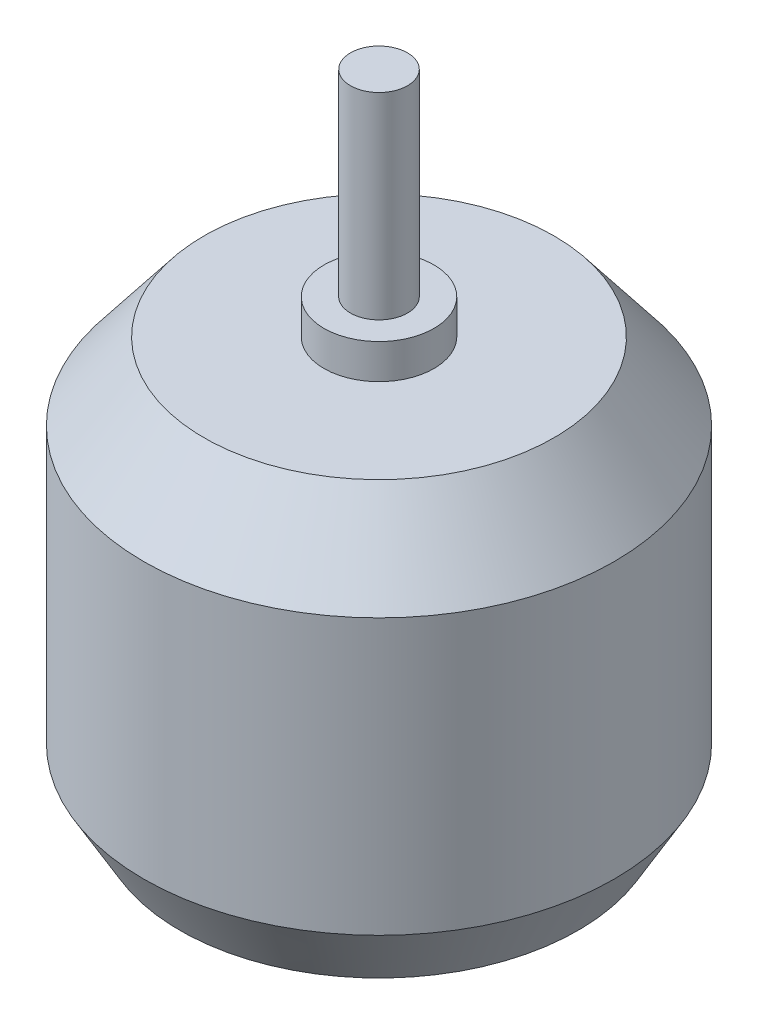
ISO-10303-21;
HEADER;
FILE_DESCRIPTION(('STEP AP214'),'2;1');
FILE_NAME('part.step','',(''),(''),'','','');
FILE_SCHEMA(('AUTOMOTIVE_DESIGN { 1 0 10303 214 1 1 1 1 }'));
ENDSEC;
DATA;
#1=APPLICATION_CONTEXT('core data for automotive mechanical design processes');
#2=APPLICATION_PROTOCOL_DEFINITION('international standard','automotive_design',2000,#1);
#3=PRODUCT_CONTEXT('',#1,'mechanical');
#4=PRODUCT('Part','Part','',(#3));
#5=PRODUCT_RELATED_PRODUCT_CATEGORY('part','',(#4));
#6=PRODUCT_DEFINITION_FORMATION('','',#4);
#7=PRODUCT_DEFINITION_CONTEXT('part definition',#1,'design');
#8=PRODUCT_DEFINITION('design','',#6,#7);
#9=PRODUCT_DEFINITION_SHAPE('','',#8);
#10=(LENGTH_UNIT() NAMED_UNIT(*) SI_UNIT(.MILLI.,.METRE.));
#11=(NAMED_UNIT(*) PLANE_ANGLE_UNIT() SI_UNIT($,.RADIAN.));
#12=(NAMED_UNIT(*) SI_UNIT($,.STERADIAN.) SOLID_ANGLE_UNIT());
#13=UNCERTAINTY_MEASURE_WITH_UNIT(LENGTH_MEASURE(1.E-05),#10,'distance_accuracy_value','');
#14=(GEOMETRIC_REPRESENTATION_CONTEXT(3) GLOBAL_UNCERTAINTY_ASSIGNED_CONTEXT((#13)) GLOBAL_UNIT_ASSIGNED_CONTEXT((#10,
#11,#12)) REPRESENTATION_CONTEXT('',''));
#15=CARTESIAN_POINT('',(0.,0.,0.));
#16=DIRECTION('',(0.,0.,1.));
#17=DIRECTION('',(1.,0.,0.));
#18=AXIS2_PLACEMENT_3D('',#15,#16,#17);
#19=CARTESIAN_POINT('',(0.,43.64,0.));
#20=DIRECTION('',(0.,1.,0.));
#21=DIRECTION('',(0.,0.,1.));
#22=AXIS2_PLACEMENT_3D('',#19,#20,#21);
#23=PLANE('',#22);
#24=CARTESIAN_POINT('',(0.,43.64,0.));
#25=DIRECTION('',(0.,-1.,0.));
#26=DIRECTION('',(0.,0.,-1.));
#27=AXIS2_PLACEMENT_3D('',#24,#25,#26);
#28=CIRCLE('',#27,18.4186868041457);
#29=CARTESIAN_POINT('',(0.,43.64,-18.4186868041457));
#30=VERTEX_POINT('',#29);
#31=EDGE_CURVE('E10',#30,#30,#28,.T.);
#32=ORIENTED_EDGE('',*,*,#31,.F.);
#33=EDGE_LOOP('',(#32));
#34=FACE_BOUND('',#33,.T.);
#35=CARTESIAN_POINT('',(0.,43.64,0.));
#36=DIRECTION('',(0.,1.,0.));
#37=DIRECTION('',(0.,0.,1.));
#38=AXIS2_PLACEMENT_3D('',#35,#36,#37);
#39=CIRCLE('',#38,5.79);
#40=CARTESIAN_POINT('',(0.,43.64,5.79));
#41=VERTEX_POINT('',#40);
#42=EDGE_CURVE('E51',#41,#41,#39,.T.);
#43=ORIENTED_EDGE('',*,*,#42,.F.);
#44=EDGE_LOOP('',(#43));
#45=FACE_BOUND('',#44,.T.);
#46=ADVANCED_FACE('F28',(#34,#45),#23,.T.);
#47=CARTESIAN_POINT('',(20.96,0.,0.));
#48=DIRECTION('',(0.,-1.,0.));
#49=DIRECTION('',(0.,0.,-1.));
#50=AXIS2_PLACEMENT_3D('',#47,#48,#49);
#51=PLANE('',#50);
#52=CARTESIAN_POINT('',(0.,0.,0.));
#53=DIRECTION('',(0.,-1.,0.));
#54=DIRECTION('',(0.,0.,-1.));
#55=AXIS2_PLACEMENT_3D('',#52,#53,#54);
#56=CIRCLE('',#55,20.96);
#57=CARTESIAN_POINT('',(0.,0.,-20.96));
#58=VERTEX_POINT('',#57);
#59=EDGE_CURVE('E45',#58,#58,#56,.T.);
#60=ORIENTED_EDGE('',*,*,#59,.T.);
#61=EDGE_LOOP('',(#60));
#62=FACE_BOUND('',#61,.T.);
#63=ADVANCED_FACE('F30',(#62),#51,.T.);
#64=CARTESIAN_POINT('',(0.,35.5234892378508,0.));
#65=DIRECTION('',(0.,-1.,0.));
#66=DIRECTION('',(0.,0.,-1.));
#67=AXIS2_PLACEMENT_3D('',#64,#65,#66);
#68=CONICAL_SURFACE('',#67,24.76,0.663225115757847);
#69=ORIENTED_EDGE('',*,*,#31,.T.);
#70=EDGE_LOOP('',(#69));
#71=FACE_BOUND('',#70,.T.);
#72=CARTESIAN_POINT('',(0.,35.5234892378508,0.));
#73=DIRECTION('',(0.,-1.,0.));
#74=DIRECTION('',(0.,0.,-1.));
#75=AXIS2_PLACEMENT_3D('',#72,#73,#74);
#76=CIRCLE('',#75,24.76);
#77=CARTESIAN_POINT('',(0.,35.5234892378508,-24.76));
#78=VERTEX_POINT('',#77);
#79=EDGE_CURVE('E36',#78,#78,#76,.T.);
#80=ORIENTED_EDGE('',*,*,#79,.F.);
#81=EDGE_LOOP('',(#80));
#82=FACE_BOUND('',#81,.T.);
#83=ADVANCED_FACE('F84',(#71,#82),#68,.T.);
#84=CARTESIAN_POINT('',(0.,0.,0.));
#85=DIRECTION('',(0.,-1.,0.));
#86=DIRECTION('',(0.,0.,-1.));
#87=AXIS2_PLACEMENT_3D('',#84,#85,#86);
#88=CYLINDRICAL_SURFACE('',#87,24.76);
#89=ORIENTED_EDGE('',*,*,#79,.T.);
#90=EDGE_LOOP('',(#89));
#91=FACE_BOUND('',#90,.T.);
#92=CARTESIAN_POINT('',(0.,6.58179306876173,0.));
#93=DIRECTION('',(0.,-1.,0.));
#94=DIRECTION('',(0.,0.,-1.));
#95=AXIS2_PLACEMENT_3D('',#92,#93,#94);
#96=CIRCLE('',#95,24.76);
#97=CARTESIAN_POINT('',(0.,6.58179306876173,-24.76));
#98=VERTEX_POINT('',#97);
#99=EDGE_CURVE('E40',#98,#98,#96,.T.);
#100=ORIENTED_EDGE('',*,*,#99,.F.);
#101=EDGE_LOOP('',(#100));
#102=FACE_BOUND('',#101,.T.);
#103=ADVANCED_FACE('F76',(#91,#102),#88,.T.);
#104=CARTESIAN_POINT('',(0.,0.,0.));
#105=DIRECTION('',(0.,1.,0.));
#106=DIRECTION('',(0.,0.,1.));
#107=AXIS2_PLACEMENT_3D('',#104,#105,#106);
#108=CONICAL_SURFACE('',#107,20.96,0.5235987755983);
#109=ORIENTED_EDGE('',*,*,#99,.T.);
#110=EDGE_LOOP('',(#109));
#111=FACE_BOUND('',#110,.T.);
#112=ORIENTED_EDGE('',*,*,#59,.F.);
#113=EDGE_LOOP('',(#112));
#114=FACE_BOUND('',#113,.T.);
#115=ADVANCED_FACE('F67',(#111,#114),#108,.T.);
#116=CARTESIAN_POINT('',(0.,47.3,0.));
#117=DIRECTION('',(0.,1.,0.));
#118=DIRECTION('',(0.,0.,1.));
#119=AXIS2_PLACEMENT_3D('',#116,#117,#118);
#120=PLANE('',#119);
#121=CARTESIAN_POINT('',(0.,47.3,0.));
#122=DIRECTION('',(0.,1.,0.));
#123=DIRECTION('',(0.,0.,1.));
#124=AXIS2_PLACEMENT_3D('',#121,#122,#123);
#125=CIRCLE('',#124,5.79);
#126=CARTESIAN_POINT('',(0.,47.3,5.79));
#127=VERTEX_POINT('',#126);
#128=EDGE_CURVE('E54',#127,#127,#125,.T.);
#129=ORIENTED_EDGE('',*,*,#128,.T.);
#130=EDGE_LOOP('',(#129));
#131=FACE_BOUND('',#130,.T.);
#132=CARTESIAN_POINT('',(0.,47.3,0.));
#133=DIRECTION('',(0.,1.,0.));
#134=DIRECTION('',(0.,0.,1.));
#135=AXIS2_PLACEMENT_3D('',#132,#133,#134);
#136=CIRCLE('',#135,3.);
#137=CARTESIAN_POINT('',(0.,47.3,3.));
#138=VERTEX_POINT('',#137);
#139=EDGE_CURVE('E32',#138,#138,#136,.T.);
#140=ORIENTED_EDGE('',*,*,#139,.F.);
#141=EDGE_LOOP('',(#140));
#142=FACE_BOUND('',#141,.T.);
#143=ADVANCED_FACE('F64',(#131,#142),#120,.T.);
#144=CARTESIAN_POINT('',(0.,47.3,0.));
#145=DIRECTION('',(0.,-1.,0.));
#146=DIRECTION('',(0.,0.,-1.));
#147=AXIS2_PLACEMENT_3D('',#144,#145,#146);
#148=CYLINDRICAL_SURFACE('',#147,5.79);
#149=ORIENTED_EDGE('',*,*,#128,.F.);
#150=EDGE_LOOP('',(#149));
#151=FACE_BOUND('',#150,.T.);
#152=ORIENTED_EDGE('',*,*,#42,.T.);
#153=EDGE_LOOP('',(#152));
#154=FACE_BOUND('',#153,.T.);
#155=ADVANCED_FACE('F66',(#151,#154),#148,.T.);
#156=CARTESIAN_POINT('',(0.,68.03,0.));
#157=DIRECTION('',(0.,1.,0.));
#158=DIRECTION('',(0.,0.,1.));
#159=AXIS2_PLACEMENT_3D('',#156,#157,#158);
#160=PLANE('',#159);
#161=CARTESIAN_POINT('',(0.,68.03,0.));
#162=DIRECTION('',(0.,1.,0.));
#163=DIRECTION('',(0.,0.,1.));
#164=AXIS2_PLACEMENT_3D('',#161,#162,#163);
#165=CIRCLE('',#164,3.);
#166=CARTESIAN_POINT('',(0.,68.03,3.));
#167=VERTEX_POINT('',#166);
#168=EDGE_CURVE('E48',#167,#167,#165,.T.);
#169=ORIENTED_EDGE('',*,*,#168,.T.);
#170=EDGE_LOOP('',(#169));
#171=FACE_BOUND('',#170,.T.);
#172=ADVANCED_FACE('F73',(#171),#160,.T.);
#173=CARTESIAN_POINT('',(0.,68.03,0.));
#174=DIRECTION('',(0.,-1.,0.));
#175=DIRECTION('',(0.,0.,-1.));
#176=AXIS2_PLACEMENT_3D('',#173,#174,#175);
#177=CYLINDRICAL_SURFACE('',#176,3.);
#178=ORIENTED_EDGE('',*,*,#139,.T.);
#179=EDGE_LOOP('',(#178));
#180=FACE_BOUND('',#179,.T.);
#181=ORIENTED_EDGE('',*,*,#168,.F.);
#182=EDGE_LOOP('',(#181));
#183=FACE_BOUND('',#182,.T.);
#184=ADVANCED_FACE('F61',(#180,#183),#177,.T.);
#185=CLOSED_SHELL('',(#46,#63,#83,#103,#115,#143,#155,#172,#184));
#186=MANIFOLD_SOLID_BREP('B2',#185);
#187=ADVANCED_BREP_SHAPE_REPRESENTATION('',(#18,#186),#14);
#188=SHAPE_DEFINITION_REPRESENTATION(#9,#187);
ENDSEC;
END-ISO-10303-21;
